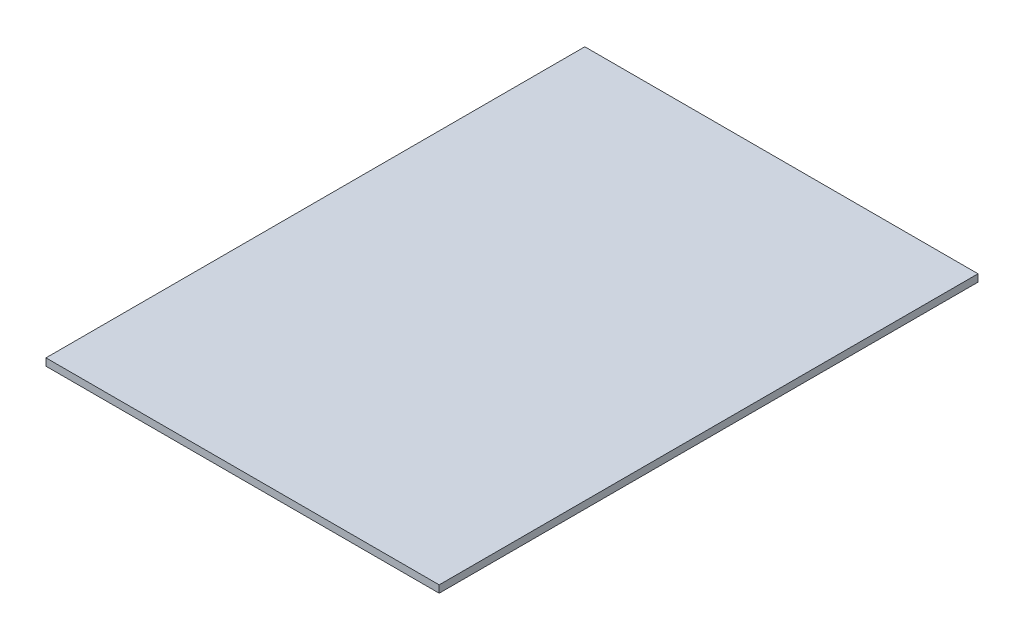
ISO-10303-21;
HEADER;
FILE_DESCRIPTION(('STEP AP214'),'2;1');
FILE_NAME('part.step','',(''),(''),'','','');
FILE_SCHEMA(('AUTOMOTIVE_DESIGN { 1 0 10303 214 1 1 1 1 }'));
ENDSEC;
DATA;
#1=APPLICATION_CONTEXT('core data for automotive mechanical design processes');
#2=APPLICATION_PROTOCOL_DEFINITION('international standard','automotive_design',2000,#1);
#3=PRODUCT_CONTEXT('',#1,'mechanical');
#4=PRODUCT('Part','Part','',(#3));
#5=PRODUCT_RELATED_PRODUCT_CATEGORY('part','',(#4));
#6=PRODUCT_DEFINITION_FORMATION('','',#4);
#7=PRODUCT_DEFINITION_CONTEXT('part definition',#1,'design');
#8=PRODUCT_DEFINITION('design','',#6,#7);
#9=PRODUCT_DEFINITION_SHAPE('','',#8);
#10=(LENGTH_UNIT() NAMED_UNIT(*) SI_UNIT(.MILLI.,.METRE.));
#11=(NAMED_UNIT(*) PLANE_ANGLE_UNIT() SI_UNIT($,.RADIAN.));
#12=(NAMED_UNIT(*) SI_UNIT($,.STERADIAN.) SOLID_ANGLE_UNIT());
#13=UNCERTAINTY_MEASURE_WITH_UNIT(LENGTH_MEASURE(1.E-05),#10,'distance_accuracy_value','');
#14=(GEOMETRIC_REPRESENTATION_CONTEXT(3) GLOBAL_UNCERTAINTY_ASSIGNED_CONTEXT((#13)) GLOBAL_UNIT_ASSIGNED_CONTEXT((#10,
#11,#12)) REPRESENTATION_CONTEXT('',''));
#15=CARTESIAN_POINT('',(0.,0.,0.));
#16=DIRECTION('',(0.,0.,1.));
#17=DIRECTION('',(1.,0.,0.));
#18=AXIS2_PLACEMENT_3D('',#15,#16,#17);
#19=CARTESIAN_POINT('',(0.,5.,0.));
#20=DIRECTION('',(1.,0.,0.));
#21=DIRECTION('',(0.,0.,-1.));
#22=AXIS2_PLACEMENT_3D('',#19,#20,#21);
#23=PLANE('',#22);
#24=DIRECTION('',(0.,0.,1.));
#25=VECTOR('',#24,1.);
#26=CARTESIAN_POINT('',(0.,0.,0.));
#27=LINE('',#26,#25);
#28=CARTESIAN_POINT('',(0.,0.,-370.));
#29=VERTEX_POINT('',#28);
#30=CARTESIAN_POINT('',(0.,0.,0.));
#31=VERTEX_POINT('',#30);
#32=EDGE_CURVE('E96',#29,#31,#27,.T.);
#33=ORIENTED_EDGE('',*,*,#32,.T.);
#34=DIRECTION('',(0.,-1.,0.));
#35=VECTOR('',#34,1.);
#36=CARTESIAN_POINT('',(0.,5.,0.));
#37=LINE('',#36,#35);
#38=CARTESIAN_POINT('',(0.,5.,0.));
#39=VERTEX_POINT('',#38);
#40=EDGE_CURVE('E11',#39,#31,#37,.T.);
#41=ORIENTED_EDGE('',*,*,#40,.F.);
#42=DIRECTION('',(0.,0.,1.));
#43=VECTOR('',#42,1.);
#44=CARTESIAN_POINT('',(0.,5.,0.));
#45=LINE('',#44,#43);
#46=CARTESIAN_POINT('',(0.,5.,-370.));
#47=VERTEX_POINT('',#46);
#48=EDGE_CURVE('E84',#47,#39,#45,.T.);
#49=ORIENTED_EDGE('',*,*,#48,.F.);
#50=DIRECTION('',(0.,-1.,0.));
#51=VECTOR('',#50,1.);
#52=CARTESIAN_POINT('',(0.,5.,-370.));
#53=LINE('',#52,#51);
#54=EDGE_CURVE('E92',#47,#29,#53,.T.);
#55=ORIENTED_EDGE('',*,*,#54,.T.);
#56=EDGE_LOOP('',(#33,#41,#49,#55));
#57=FACE_BOUND('',#56,.T.);
#58=ADVANCED_FACE('F33',(#57),#23,.F.);
#59=CARTESIAN_POINT('',(0.,5.,0.));
#60=DIRECTION('',(0.,0.,-1.));
#61=DIRECTION('',(-1.,0.,0.));
#62=AXIS2_PLACEMENT_3D('',#59,#60,#61);
#63=PLANE('',#62);
#64=DIRECTION('',(1.,0.,0.));
#65=VECTOR('',#64,1.);
#66=CARTESIAN_POINT('',(0.,0.,0.));
#67=LINE('',#66,#65);
#68=CARTESIAN_POINT('',(270.,0.,0.));
#69=VERTEX_POINT('',#68);
#70=EDGE_CURVE('E88',#31,#69,#67,.T.);
#71=ORIENTED_EDGE('',*,*,#70,.T.);
#72=DIRECTION('',(0.,-1.,0.));
#73=VECTOR('',#72,1.);
#74=CARTESIAN_POINT('',(270.,5.,0.));
#75=LINE('',#74,#73);
#76=CARTESIAN_POINT('',(270.,5.,0.));
#77=VERTEX_POINT('',#76);
#78=EDGE_CURVE('E41',#77,#69,#75,.T.);
#79=ORIENTED_EDGE('',*,*,#78,.F.);
#80=DIRECTION('',(1.,0.,0.));
#81=VECTOR('',#80,1.);
#82=CARTESIAN_POINT('',(0.,5.,0.));
#83=LINE('',#82,#81);
#84=EDGE_CURVE('E79',#39,#77,#83,.T.);
#85=ORIENTED_EDGE('',*,*,#84,.F.);
#86=ORIENTED_EDGE('',*,*,#40,.T.);
#87=EDGE_LOOP('',(#71,#79,#85,#86));
#88=FACE_BOUND('',#87,.T.);
#89=ADVANCED_FACE('F87',(#88),#63,.F.);
#90=CARTESIAN_POINT('',(270.,5.,0.));
#91=DIRECTION('',(-1.,0.,0.));
#92=DIRECTION('',(0.,0.,1.));
#93=AXIS2_PLACEMENT_3D('',#90,#91,#92);
#94=PLANE('',#93);
#95=DIRECTION('',(0.,0.,-1.));
#96=VECTOR('',#95,1.);
#97=CARTESIAN_POINT('',(270.,0.,0.));
#98=LINE('',#97,#96);
#99=CARTESIAN_POINT('',(270.,0.,-370.));
#100=VERTEX_POINT('',#99);
#101=EDGE_CURVE('E66',#69,#100,#98,.T.);
#102=ORIENTED_EDGE('',*,*,#101,.T.);
#103=DIRECTION('',(0.,-1.,0.));
#104=VECTOR('',#103,1.);
#105=CARTESIAN_POINT('',(270.,5.,-370.));
#106=LINE('',#105,#104);
#107=CARTESIAN_POINT('',(270.,5.,-370.));
#108=VERTEX_POINT('',#107);
#109=EDGE_CURVE('E89',#108,#100,#106,.T.);
#110=ORIENTED_EDGE('',*,*,#109,.F.);
#111=DIRECTION('',(0.,0.,-1.));
#112=VECTOR('',#111,1.);
#113=CARTESIAN_POINT('',(270.,5.,0.));
#114=LINE('',#113,#112);
#115=EDGE_CURVE('E82',#77,#108,#114,.T.);
#116=ORIENTED_EDGE('',*,*,#115,.F.);
#117=ORIENTED_EDGE('',*,*,#78,.T.);
#118=EDGE_LOOP('',(#102,#110,#116,#117));
#119=FACE_BOUND('',#118,.T.);
#120=ADVANCED_FACE('F90',(#119),#94,.F.);
#121=CARTESIAN_POINT('',(0.,5.,-370.));
#122=DIRECTION('',(0.,0.,1.));
#123=DIRECTION('',(1.,0.,0.));
#124=AXIS2_PLACEMENT_3D('',#121,#122,#123);
#125=PLANE('',#124);
#126=DIRECTION('',(-1.,0.,0.));
#127=VECTOR('',#126,1.);
#128=CARTESIAN_POINT('',(0.,0.,-370.));
#129=LINE('',#128,#127);
#130=EDGE_CURVE('E72',#100,#29,#129,.T.);
#131=ORIENTED_EDGE('',*,*,#130,.T.);
#132=ORIENTED_EDGE('',*,*,#54,.F.);
#133=DIRECTION('',(-1.,0.,0.));
#134=VECTOR('',#133,1.);
#135=CARTESIAN_POINT('',(0.,5.,-370.));
#136=LINE('',#135,#134);
#137=EDGE_CURVE('E49',#108,#47,#136,.T.);
#138=ORIENTED_EDGE('',*,*,#137,.F.);
#139=ORIENTED_EDGE('',*,*,#109,.T.);
#140=EDGE_LOOP('',(#131,#132,#138,#139));
#141=FACE_BOUND('',#140,.T.);
#142=ADVANCED_FACE('F103',(#141),#125,.F.);
#143=CARTESIAN_POINT('',(0.,5.,0.));
#144=DIRECTION('',(0.,-1.,0.));
#145=DIRECTION('',(0.,0.,-1.));
#146=AXIS2_PLACEMENT_3D('',#143,#144,#145);
#147=PLANE('',#146);
#148=ORIENTED_EDGE('',*,*,#48,.T.);
#149=ORIENTED_EDGE('',*,*,#84,.T.);
#150=ORIENTED_EDGE('',*,*,#115,.T.);
#151=ORIENTED_EDGE('',*,*,#137,.T.);
#152=EDGE_LOOP('',(#148,#149,#150,#151));
#153=FACE_BOUND('',#152,.T.);
#154=ADVANCED_FACE('F80',(#153),#147,.F.);
#155=CARTESIAN_POINT('',(0.,0.,0.));
#156=DIRECTION('',(0.,-1.,0.));
#157=DIRECTION('',(0.,0.,-1.));
#158=AXIS2_PLACEMENT_3D('',#155,#156,#157);
#159=PLANE('',#158);
#160=ORIENTED_EDGE('',*,*,#32,.F.);
#161=ORIENTED_EDGE('',*,*,#130,.F.);
#162=ORIENTED_EDGE('',*,*,#101,.F.);
#163=ORIENTED_EDGE('',*,*,#70,.F.);
#164=EDGE_LOOP('',(#160,#161,#162,#163));
#165=FACE_BOUND('',#164,.T.);
#166=ADVANCED_FACE('F106',(#165),#159,.T.);
#167=CLOSED_SHELL('',(#58,#89,#120,#142,#154,#166));
#168=MANIFOLD_SOLID_BREP('B2',#167);
#169=ADVANCED_BREP_SHAPE_REPRESENTATION('',(#18,#168),#14);
#170=SHAPE_DEFINITION_REPRESENTATION(#9,#169);
ENDSEC;
END-ISO-10303-21;
